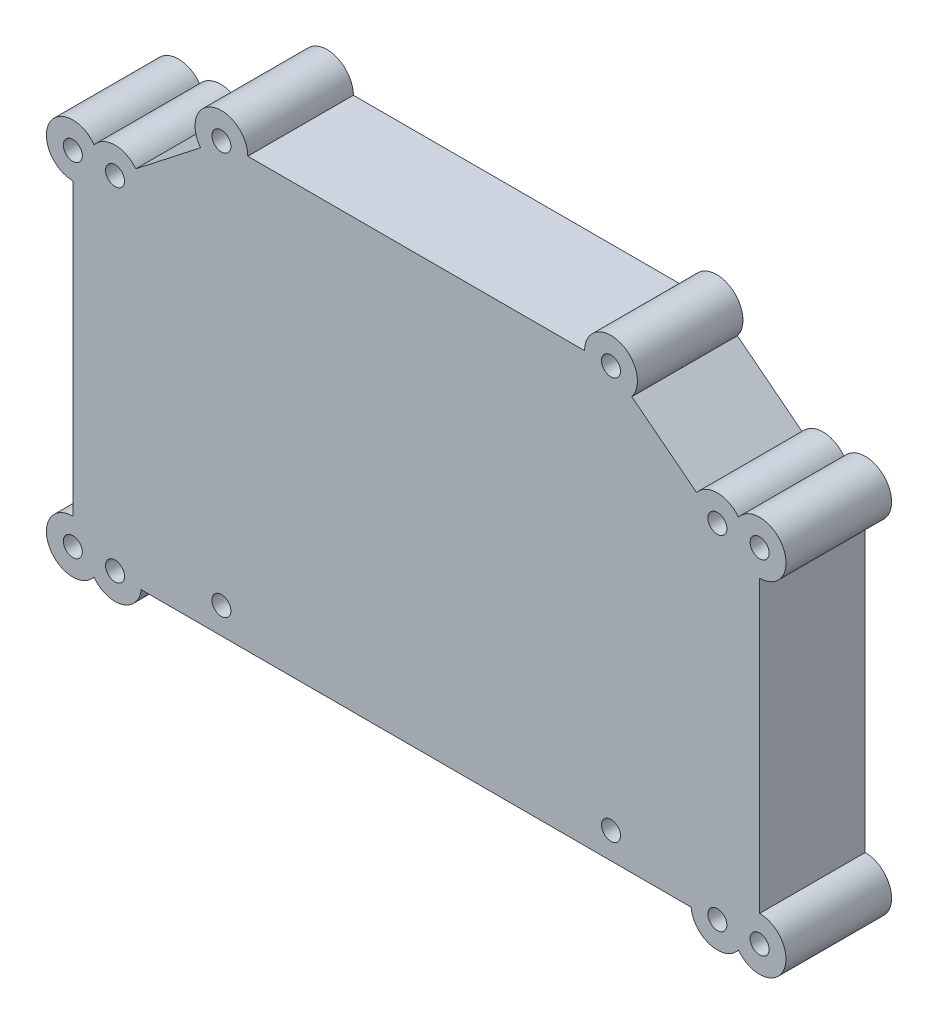
ISO-10303-21;
HEADER;
FILE_DESCRIPTION(('STEP AP214'),'2;1');
FILE_NAME('part.step','',(''),(''),'','','');
FILE_SCHEMA(('AUTOMOTIVE_DESIGN { 1 0 10303 214 1 1 1 1 }'));
ENDSEC;
DATA;
#1=APPLICATION_CONTEXT('core data for automotive mechanical design processes');
#2=APPLICATION_PROTOCOL_DEFINITION('international standard','automotive_design',2000,#1);
#3=PRODUCT_CONTEXT('',#1,'mechanical');
#4=PRODUCT('Part','Part','',(#3));
#5=PRODUCT_RELATED_PRODUCT_CATEGORY('part','',(#4));
#6=PRODUCT_DEFINITION_FORMATION('','',#4);
#7=PRODUCT_DEFINITION_CONTEXT('part definition',#1,'design');
#8=PRODUCT_DEFINITION('design','',#6,#7);
#9=PRODUCT_DEFINITION_SHAPE('','',#8);
#10=(LENGTH_UNIT() NAMED_UNIT(*) SI_UNIT(.MILLI.,.METRE.));
#11=(NAMED_UNIT(*) PLANE_ANGLE_UNIT() SI_UNIT($,.RADIAN.));
#12=(NAMED_UNIT(*) SI_UNIT($,.STERADIAN.) SOLID_ANGLE_UNIT());
#13=UNCERTAINTY_MEASURE_WITH_UNIT(LENGTH_MEASURE(1.E-05),#10,'distance_accuracy_value','');
#14=(GEOMETRIC_REPRESENTATION_CONTEXT(3) GLOBAL_UNCERTAINTY_ASSIGNED_CONTEXT((#13)) GLOBAL_UNIT_ASSIGNED_CONTEXT((#10,
#11,#12)) REPRESENTATION_CONTEXT('',''));
#15=CARTESIAN_POINT('',(0.,0.,0.));
#16=DIRECTION('',(0.,0.,1.));
#17=DIRECTION('',(1.,0.,0.));
#18=AXIS2_PLACEMENT_3D('',#15,#16,#17);
#19=CARTESIAN_POINT('',(0.,-43.1,20.));
#20=DIRECTION('',(0.,-1.,0.));
#21=DIRECTION('',(0.,0.,-1.));
#22=AXIS2_PLACEMENT_3D('',#19,#20,#21);
#23=PLANE('',#22);
#24=DIRECTION('',(-1.,0.,0.));
#25=VECTOR('',#24,1.);
#26=CARTESIAN_POINT('',(0.,-43.1,0.));
#27=LINE('',#26,#25);
#28=CARTESIAN_POINT('',(52.0702911731709,-43.1,0.));
#29=VERTEX_POINT('',#28);
#30=CARTESIAN_POINT('',(-52.0844733465611,-43.1,0.));
#31=VERTEX_POINT('',#30);
#32=EDGE_CURVE('E357',#29,#31,#27,.T.);
#33=ORIENTED_EDGE('',*,*,#32,.F.);
#34=DIRECTION('',(0.,0.,-1.));
#35=VECTOR('',#34,1.);
#36=CARTESIAN_POINT('',(52.0702911731709,-43.1,20.));
#37=LINE('',#36,#35);
#38=CARTESIAN_POINT('',(52.0702911731709,-43.1,20.));
#39=VERTEX_POINT('',#38);
#40=EDGE_CURVE('E12',#39,#29,#37,.T.);
#41=ORIENTED_EDGE('',*,*,#40,.F.);
#42=DIRECTION('',(-1.,0.,0.));
#43=VECTOR('',#42,1.);
#44=CARTESIAN_POINT('',(0.,-43.1,20.));
#45=LINE('',#44,#43);
#46=CARTESIAN_POINT('',(-52.0844733465611,-43.1,20.));
#47=VERTEX_POINT('',#46);
#48=EDGE_CURVE('E263',#39,#47,#45,.T.);
#49=ORIENTED_EDGE('',*,*,#48,.T.);
#50=DIRECTION('',(0.,0.,-1.));
#51=VECTOR('',#50,1.);
#52=CARTESIAN_POINT('',(-52.0844733465611,-43.1,20.));
#53=LINE('',#52,#51);
#54=EDGE_CURVE('E119',#47,#31,#53,.T.);
#55=ORIENTED_EDGE('',*,*,#54,.T.);
#56=EDGE_LOOP('',(#33,#41,#49,#55));
#57=FACE_BOUND('',#56,.T.);
#58=ADVANCED_FACE('F45',(#57),#23,.T.);
#59=CARTESIAN_POINT('',(57.05,-42.65,20.));
#60=DIRECTION('',(0.,0.,-1.));
#61=DIRECTION('',(-1.,0.,0.));
#62=AXIS2_PLACEMENT_3D('',#59,#60,#61);
#63=CYLINDRICAL_SURFACE('',#62,4.99999999999999);
#64=CARTESIAN_POINT('',(57.05,-42.65,0.));
#65=DIRECTION('',(0.,0.,1.));
#66=DIRECTION('',(1.,0.,0.));
#67=AXIS2_PLACEMENT_3D('',#64,#65,#66);
#68=CIRCLE('',#67,4.99999999999999);
#69=CARTESIAN_POINT('',(61.05,-45.65,0.));
#70=VERTEX_POINT('',#69);
#71=EDGE_CURVE('E348',#29,#70,#68,.T.);
#72=ORIENTED_EDGE('',*,*,#71,.T.);
#73=DIRECTION('',(0.,0.,-1.));
#74=VECTOR('',#73,1.);
#75=CARTESIAN_POINT('',(61.05,-45.65,20.));
#76=LINE('',#75,#74);
#77=CARTESIAN_POINT('',(61.05,-45.65,20.));
#78=VERTEX_POINT('',#77);
#79=EDGE_CURVE('E52',#78,#70,#76,.T.);
#80=ORIENTED_EDGE('',*,*,#79,.F.);
#81=CARTESIAN_POINT('',(57.05,-42.65,20.));
#82=DIRECTION('',(0.,0.,1.));
#83=DIRECTION('',(1.,0.,0.));
#84=AXIS2_PLACEMENT_3D('',#81,#82,#83);
#85=CIRCLE('',#84,4.99999999999999);
#86=EDGE_CURVE('E267',#39,#78,#85,.T.);
#87=ORIENTED_EDGE('',*,*,#86,.F.);
#88=ORIENTED_EDGE('',*,*,#40,.T.);
#89=EDGE_LOOP('',(#72,#80,#87,#88));
#90=FACE_BOUND('',#89,.T.);
#91=ADVANCED_FACE('F537',(#90),#63,.T.);
#92=CARTESIAN_POINT('',(65.05,-42.65,20.));
#93=DIRECTION('',(0.,0.,-1.));
#94=DIRECTION('',(-1.,0.,0.));
#95=AXIS2_PLACEMENT_3D('',#92,#93,#94);
#96=CYLINDRICAL_SURFACE('',#95,5.);
#97=CARTESIAN_POINT('',(65.05,-42.65,0.));
#98=DIRECTION('',(0.,0.,1.));
#99=DIRECTION('',(1.,0.,0.));
#100=AXIS2_PLACEMENT_3D('',#97,#98,#99);
#101=CIRCLE('',#100,5.);
#102=CARTESIAN_POINT('',(65.05,-37.65,0.));
#103=VERTEX_POINT('',#102);
#104=EDGE_CURVE('E340',#70,#103,#101,.T.);
#105=ORIENTED_EDGE('',*,*,#104,.T.);
#106=DIRECTION('',(0.,0.,-1.));
#107=VECTOR('',#106,1.);
#108=CARTESIAN_POINT('',(65.05,-37.65,20.));
#109=LINE('',#108,#107);
#110=CARTESIAN_POINT('',(65.05,-37.65,20.));
#111=VERTEX_POINT('',#110);
#112=EDGE_CURVE('E327',#111,#103,#109,.T.);
#113=ORIENTED_EDGE('',*,*,#112,.F.);
#114=CARTESIAN_POINT('',(65.05,-42.65,20.));
#115=DIRECTION('',(0.,0.,1.));
#116=DIRECTION('',(1.,0.,0.));
#117=AXIS2_PLACEMENT_3D('',#114,#115,#116);
#118=CIRCLE('',#117,5.);
#119=EDGE_CURVE('E279',#78,#111,#118,.T.);
#120=ORIENTED_EDGE('',*,*,#119,.F.);
#121=ORIENTED_EDGE('',*,*,#79,.T.);
#122=EDGE_LOOP('',(#105,#113,#120,#121));
#123=FACE_BOUND('',#122,.T.);
#124=ADVANCED_FACE('F338',(#123),#96,.T.);
#125=CARTESIAN_POINT('',(65.05,0.,20.));
#126=DIRECTION('',(1.,0.,0.));
#127=DIRECTION('',(0.,1.,0.));
#128=AXIS2_PLACEMENT_3D('',#125,#126,#127);
#129=PLANE('',#128);
#130=DIRECTION('',(0.,-1.,0.));
#131=VECTOR('',#130,1.);
#132=CARTESIAN_POINT('',(65.05,0.,0.));
#133=LINE('',#132,#131);
#134=CARTESIAN_POINT('',(65.05,17.35,0.));
#135=VERTEX_POINT('',#134);
#136=EDGE_CURVE('E351',#135,#103,#133,.T.);
#137=ORIENTED_EDGE('',*,*,#136,.F.);
#138=DIRECTION('',(0.,0.,-1.));
#139=VECTOR('',#138,1.);
#140=CARTESIAN_POINT('',(65.05,17.35,20.));
#141=LINE('',#140,#139);
#142=CARTESIAN_POINT('',(65.05,17.35,20.));
#143=VERTEX_POINT('',#142);
#144=EDGE_CURVE('E323',#143,#135,#141,.T.);
#145=ORIENTED_EDGE('',*,*,#144,.F.);
#146=DIRECTION('',(0.,-1.,0.));
#147=VECTOR('',#146,1.);
#148=CARTESIAN_POINT('',(65.05,0.,20.));
#149=LINE('',#148,#147);
#150=EDGE_CURVE('E282',#143,#111,#149,.T.);
#151=ORIENTED_EDGE('',*,*,#150,.T.);
#152=ORIENTED_EDGE('',*,*,#112,.T.);
#153=EDGE_LOOP('',(#137,#145,#151,#152));
#154=FACE_BOUND('',#153,.T.);
#155=ADVANCED_FACE('F662',(#154),#129,.T.);
#156=CARTESIAN_POINT('',(65.05,22.35,20.));
#157=DIRECTION('',(0.,0.,-1.));
#158=DIRECTION('',(-1.,0.,0.));
#159=AXIS2_PLACEMENT_3D('',#156,#157,#158);
#160=CYLINDRICAL_SURFACE('',#159,5.);
#161=CARTESIAN_POINT('',(65.05,22.35,0.));
#162=DIRECTION('',(0.,0.,1.));
#163=DIRECTION('',(1.,0.,0.));
#164=AXIS2_PLACEMENT_3D('',#161,#162,#163);
#165=CIRCLE('',#164,5.);
#166=CARTESIAN_POINT('',(61.05,25.35,0.));
#167=VERTEX_POINT('',#166);
#168=EDGE_CURVE('E356',#135,#167,#165,.T.);
#169=ORIENTED_EDGE('',*,*,#168,.T.);
#170=DIRECTION('',(0.,0.,-1.));
#171=VECTOR('',#170,1.);
#172=CARTESIAN_POINT('',(61.05,25.35,20.));
#173=LINE('',#172,#171);
#174=CARTESIAN_POINT('',(61.05,25.35,20.));
#175=VERTEX_POINT('',#174);
#176=EDGE_CURVE('E319',#175,#167,#173,.T.);
#177=ORIENTED_EDGE('',*,*,#176,.F.);
#178=CARTESIAN_POINT('',(65.05,22.35,20.));
#179=DIRECTION('',(0.,0.,1.));
#180=DIRECTION('',(1.,0.,0.));
#181=AXIS2_PLACEMENT_3D('',#178,#179,#180);
#182=CIRCLE('',#181,5.);
#183=EDGE_CURVE('E288',#143,#175,#182,.T.);
#184=ORIENTED_EDGE('',*,*,#183,.F.);
#185=ORIENTED_EDGE('',*,*,#144,.T.);
#186=EDGE_LOOP('',(#169,#177,#184,#185));
#187=FACE_BOUND('',#186,.T.);
#188=ADVANCED_FACE('F736',(#187),#160,.T.);
#189=CARTESIAN_POINT('',(57.05,22.35,20.));
#190=DIRECTION('',(0.,0.,-1.));
#191=DIRECTION('',(-1.,0.,0.));
#192=AXIS2_PLACEMENT_3D('',#189,#190,#191);
#193=CYLINDRICAL_SURFACE('',#192,5.);
#194=CARTESIAN_POINT('',(57.05,22.35,0.));
#195=DIRECTION('',(0.,0.,1.));
#196=DIRECTION('',(1.,0.,0.));
#197=AXIS2_PLACEMENT_3D('',#194,#195,#196);
#198=CIRCLE('',#197,5.);
#199=CARTESIAN_POINT('',(53.1106192354054,25.4291685877104,0.));
#200=VERTEX_POINT('',#199);
#201=EDGE_CURVE('E378',#167,#200,#198,.T.);
#202=ORIENTED_EDGE('',*,*,#201,.T.);
#203=DIRECTION('',(0.,0.,-1.));
#204=VECTOR('',#203,1.);
#205=CARTESIAN_POINT('',(53.1106192354054,25.4291685877104,20.));
#206=LINE('',#205,#204);
#207=CARTESIAN_POINT('',(53.1106192354054,25.4291685877104,20.));
#208=VERTEX_POINT('',#207);
#209=EDGE_CURVE('E306',#208,#200,#206,.T.);
#210=ORIENTED_EDGE('',*,*,#209,.F.);
#211=CARTESIAN_POINT('',(57.05,22.35,20.));
#212=DIRECTION('',(0.,0.,1.));
#213=DIRECTION('',(1.,0.,0.));
#214=AXIS2_PLACEMENT_3D('',#211,#212,#213);
#215=CIRCLE('',#214,5.);
#216=EDGE_CURVE('E454',#175,#208,#215,.T.);
#217=ORIENTED_EDGE('',*,*,#216,.F.);
#218=ORIENTED_EDGE('',*,*,#176,.T.);
#219=EDGE_LOOP('',(#202,#210,#217,#218));
#220=FACE_BOUND('',#219,.T.);
#221=ADVANCED_FACE('F657',(#220),#193,.T.);
#222=CARTESIAN_POINT('',(32.4805147649006,41.5544363500157,20.));
#223=DIRECTION('',(0.615833717542077,0.787876152918912,0.));
#224=DIRECTION('',(-0.787876152918912,0.615833717542077,0.));
#225=AXIS2_PLACEMENT_3D('',#222,#223,#224);
#226=PLANE('',#225);
#227=DIRECTION('',(0.787876152918912,-0.615833717542077,0.));
#228=VECTOR('',#227,1.);
#229=CARTESIAN_POINT('',(32.4805147649006,41.5544363500157,0.));
#230=LINE('',#229,#228);
#231=CARTESIAN_POINT('',(40.8393807645946,35.0208314122896,0.));
#232=VERTEX_POINT('',#231);
#233=EDGE_CURVE('E571',#232,#200,#230,.T.);
#234=ORIENTED_EDGE('',*,*,#233,.F.);
#235=DIRECTION('',(0.,0.,-1.));
#236=VECTOR('',#235,1.);
#237=CARTESIAN_POINT('',(40.8393807645946,35.0208314122896,20.));
#238=LINE('',#237,#236);
#239=CARTESIAN_POINT('',(40.8393807645946,35.0208314122896,20.));
#240=VERTEX_POINT('',#239);
#241=EDGE_CURVE('E301',#240,#232,#238,.T.);
#242=ORIENTED_EDGE('',*,*,#241,.F.);
#243=DIRECTION('',(0.787876152918912,-0.615833717542077,0.));
#244=VECTOR('',#243,1.);
#245=CARTESIAN_POINT('',(32.4805147649006,41.5544363500157,20.));
#246=LINE('',#245,#244);
#247=EDGE_CURVE('E449',#240,#208,#246,.T.);
#248=ORIENTED_EDGE('',*,*,#247,.T.);
#249=ORIENTED_EDGE('',*,*,#209,.T.);
#250=EDGE_LOOP('',(#234,#242,#248,#249));
#251=FACE_BOUND('',#250,.T.);
#252=ADVANCED_FACE('F730',(#251),#226,.T.);
#253=CARTESIAN_POINT('',(36.9,38.1,20.));
#254=DIRECTION('',(0.,0.,-1.));
#255=DIRECTION('',(-1.,0.,0.));
#256=AXIS2_PLACEMENT_3D('',#253,#254,#255);
#257=CYLINDRICAL_SURFACE('',#256,5.);
#258=CARTESIAN_POINT('',(36.9,38.1,0.));
#259=DIRECTION('',(0.,0.,1.));
#260=DIRECTION('',(1.,0.,0.));
#261=AXIS2_PLACEMENT_3D('',#258,#259,#260);
#262=CIRCLE('',#261,5.);
#263=CARTESIAN_POINT('',(31.9,38.1,0.));
#264=VERTEX_POINT('',#263);
#265=EDGE_CURVE('E566',#232,#264,#262,.T.);
#266=ORIENTED_EDGE('',*,*,#265,.T.);
#267=DIRECTION('',(0.,0.,-1.));
#268=VECTOR('',#267,1.);
#269=CARTESIAN_POINT('',(31.9,38.1,20.));
#270=LINE('',#269,#268);
#271=CARTESIAN_POINT('',(31.9,38.1,20.));
#272=VERTEX_POINT('',#271);
#273=EDGE_CURVE('E307',#272,#264,#270,.T.);
#274=ORIENTED_EDGE('',*,*,#273,.F.);
#275=CARTESIAN_POINT('',(36.9,38.1,20.));
#276=DIRECTION('',(0.,0.,1.));
#277=DIRECTION('',(1.,0.,0.));
#278=AXIS2_PLACEMENT_3D('',#275,#276,#277);
#279=CIRCLE('',#278,5.);
#280=EDGE_CURVE('E446',#240,#272,#279,.T.);
#281=ORIENTED_EDGE('',*,*,#280,.F.);
#282=ORIENTED_EDGE('',*,*,#241,.T.);
#283=EDGE_LOOP('',(#266,#274,#281,#282));
#284=FACE_BOUND('',#283,.T.);
#285=ADVANCED_FACE('F567',(#284),#257,.T.);
#286=CARTESIAN_POINT('',(0.,38.1,20.));
#287=DIRECTION('',(0.,1.,0.));
#288=DIRECTION('',(0.,0.,1.));
#289=AXIS2_PLACEMENT_3D('',#286,#287,#288);
#290=PLANE('',#289);
#291=DIRECTION('',(1.,0.,0.));
#292=VECTOR('',#291,1.);
#293=CARTESIAN_POINT('',(0.,38.1,0.));
#294=LINE('',#293,#292);
#295=CARTESIAN_POINT('',(-31.9,38.1,0.));
#296=VERTEX_POINT('',#295);
#297=EDGE_CURVE('E395',#296,#264,#294,.T.);
#298=ORIENTED_EDGE('',*,*,#297,.F.);
#299=DIRECTION('',(0.,0.,-1.));
#300=VECTOR('',#299,1.);
#301=CARTESIAN_POINT('',(-31.9,38.1,20.));
#302=LINE('',#301,#300);
#303=CARTESIAN_POINT('',(-31.9,38.1,20.));
#304=VERTEX_POINT('',#303);
#305=EDGE_CURVE('E546',#304,#296,#302,.T.);
#306=ORIENTED_EDGE('',*,*,#305,.F.);
#307=DIRECTION('',(1.,0.,0.));
#308=VECTOR('',#307,1.);
#309=CARTESIAN_POINT('',(0.,38.1,20.));
#310=LINE('',#309,#308);
#311=EDGE_CURVE('E241',#304,#272,#310,.T.);
#312=ORIENTED_EDGE('',*,*,#311,.T.);
#313=ORIENTED_EDGE('',*,*,#273,.T.);
#314=EDGE_LOOP('',(#298,#306,#312,#313));
#315=FACE_BOUND('',#314,.T.);
#316=ADVANCED_FACE('F560',(#315),#290,.T.);
#317=CARTESIAN_POINT('',(-36.9,38.1,20.));
#318=DIRECTION('',(0.,0.,-1.));
#319=DIRECTION('',(-1.,0.,0.));
#320=AXIS2_PLACEMENT_3D('',#317,#318,#319);
#321=CYLINDRICAL_SURFACE('',#320,5.);
#322=CARTESIAN_POINT('',(-36.9,38.1,0.));
#323=DIRECTION('',(0.,0.,1.));
#324=DIRECTION('',(1.,0.,0.));
#325=AXIS2_PLACEMENT_3D('',#322,#323,#324);
#326=CIRCLE('',#325,5.);
#327=CARTESIAN_POINT('',(-40.839380764594,35.0208314122889,0.));
#328=VERTEX_POINT('',#327);
#329=EDGE_CURVE('E388',#296,#328,#326,.T.);
#330=ORIENTED_EDGE('',*,*,#329,.T.);
#331=DIRECTION('',(0.,0.,-1.));
#332=VECTOR('',#331,1.);
#333=CARTESIAN_POINT('',(-40.839380764594,35.0208314122889,20.));
#334=LINE('',#333,#332);
#335=CARTESIAN_POINT('',(-40.839380764594,35.0208314122889,20.));
#336=VERTEX_POINT('',#335);
#337=EDGE_CURVE('E544',#336,#328,#334,.T.);
#338=ORIENTED_EDGE('',*,*,#337,.F.);
#339=CARTESIAN_POINT('',(-36.9,38.1,20.));
#340=DIRECTION('',(0.,0.,1.));
#341=DIRECTION('',(1.,0.,0.));
#342=AXIS2_PLACEMENT_3D('',#339,#340,#341);
#343=CIRCLE('',#342,5.);
#344=EDGE_CURVE('E236',#304,#336,#343,.T.);
#345=ORIENTED_EDGE('',*,*,#344,.F.);
#346=ORIENTED_EDGE('',*,*,#305,.T.);
#347=EDGE_LOOP('',(#330,#338,#345,#346));
#348=FACE_BOUND('',#347,.T.);
#349=ADVANCED_FACE('F677',(#348),#321,.T.);
#350=CARTESIAN_POINT('',(-32.480514764898,41.554436350016,20.));
#351=DIRECTION('',(-0.615833717542045,0.787876152918938,0.));
#352=DIRECTION('',(-0.787876152918938,-0.615833717542045,0.));
#353=AXIS2_PLACEMENT_3D('',#350,#351,#352);
#354=PLANE('',#353);
#355=DIRECTION('',(0.787876152918938,0.615833717542045,0.));
#356=VECTOR('',#355,1.);
#357=CARTESIAN_POINT('',(-32.480514764898,41.554436350016,0.));
#358=LINE('',#357,#356);
#359=CARTESIAN_POINT('',(-53.1106192354053,25.4291685877102,0.));
#360=VERTEX_POINT('',#359);
#361=EDGE_CURVE('E394',#360,#328,#358,.T.);
#362=ORIENTED_EDGE('',*,*,#361,.F.);
#363=DIRECTION('',(0.,0.,-1.));
#364=VECTOR('',#363,1.);
#365=CARTESIAN_POINT('',(-53.1106192354053,25.4291685877102,20.));
#366=LINE('',#365,#364);
#367=CARTESIAN_POINT('',(-53.1106192354053,25.4291685877102,20.));
#368=VERTEX_POINT('',#367);
#369=EDGE_CURVE('E223',#368,#360,#366,.T.);
#370=ORIENTED_EDGE('',*,*,#369,.F.);
#371=DIRECTION('',(0.787876152918938,0.615833717542045,0.));
#372=VECTOR('',#371,1.);
#373=CARTESIAN_POINT('',(-32.480514764898,41.554436350016,20.));
#374=LINE('',#373,#372);
#375=EDGE_CURVE('E240',#368,#336,#374,.T.);
#376=ORIENTED_EDGE('',*,*,#375,.T.);
#377=ORIENTED_EDGE('',*,*,#337,.T.);
#378=EDGE_LOOP('',(#362,#370,#376,#377));
#379=FACE_BOUND('',#378,.T.);
#380=ADVANCED_FACE('F673',(#379),#354,.T.);
#381=CARTESIAN_POINT('',(-57.05,22.35,20.));
#382=DIRECTION('',(0.,0.,-1.));
#383=DIRECTION('',(-1.,0.,0.));
#384=AXIS2_PLACEMENT_3D('',#381,#382,#383);
#385=CYLINDRICAL_SURFACE('',#384,5.00000000000001);
#386=CARTESIAN_POINT('',(-57.05,22.35,0.));
#387=DIRECTION('',(0.,0.,1.));
#388=DIRECTION('',(1.,0.,0.));
#389=AXIS2_PLACEMENT_3D('',#386,#387,#388);
#390=CIRCLE('',#389,5.00000000000001);
#391=CARTESIAN_POINT('',(-60.9983731936088,25.417629235092,0.));
#392=VERTEX_POINT('',#391);
#393=EDGE_CURVE('E406',#360,#392,#390,.T.);
#394=ORIENTED_EDGE('',*,*,#393,.T.);
#395=DIRECTION('',(0.,0.,-1.));
#396=VECTOR('',#395,1.);
#397=CARTESIAN_POINT('',(-60.9983731936088,25.417629235092,20.));
#398=LINE('',#397,#396);
#399=CARTESIAN_POINT('',(-60.9983731936088,25.417629235092,20.));
#400=VERTEX_POINT('',#399);
#401=EDGE_CURVE('E219',#400,#392,#398,.T.);
#402=ORIENTED_EDGE('',*,*,#401,.F.);
#403=CARTESIAN_POINT('',(-57.05,22.35,20.));
#404=DIRECTION('',(0.,0.,1.));
#405=DIRECTION('',(1.,0.,0.));
#406=AXIS2_PLACEMENT_3D('',#403,#404,#405);
#407=CIRCLE('',#406,5.00000000000001);
#408=EDGE_CURVE('E251',#368,#400,#407,.T.);
#409=ORIENTED_EDGE('',*,*,#408,.F.);
#410=ORIENTED_EDGE('',*,*,#369,.T.);
#411=EDGE_LOOP('',(#394,#402,#409,#410));
#412=FACE_BOUND('',#411,.T.);
#413=ADVANCED_FACE('F681',(#412),#385,.T.);
#414=CARTESIAN_POINT('',(-65.0488417535076,22.4861271550533,20.));
#415=DIRECTION('',(0.,0.,-1.));
#416=DIRECTION('',(-1.,0.,0.));
#417=AXIS2_PLACEMENT_3D('',#414,#415,#416);
#418=CYLINDRICAL_SURFACE('',#417,5.);
#419=CARTESIAN_POINT('',(-65.0488417535076,22.4861271550533,0.));
#420=DIRECTION('',(0.,0.,1.));
#421=DIRECTION('',(1.,0.,0.));
#422=AXIS2_PLACEMENT_3D('',#419,#420,#421);
#423=CIRCLE('',#422,5.);
#424=CARTESIAN_POINT('',(-65.0488417535076,17.4861271550533,0.));
#425=VERTEX_POINT('',#424);
#426=EDGE_CURVE('E409',#392,#425,#423,.T.);
#427=ORIENTED_EDGE('',*,*,#426,.T.);
#428=DIRECTION('',(0.,0.,-1.));
#429=VECTOR('',#428,1.);
#430=CARTESIAN_POINT('',(-65.0488417535076,17.4861271550533,20.));
#431=LINE('',#430,#429);
#432=CARTESIAN_POINT('',(-65.0488417535076,17.4861271550533,20.));
#433=VERTEX_POINT('',#432);
#434=EDGE_CURVE('E180',#433,#425,#431,.T.);
#435=ORIENTED_EDGE('',*,*,#434,.F.);
#436=CARTESIAN_POINT('',(-65.0488417535076,22.4861271550533,20.));
#437=DIRECTION('',(0.,0.,1.));
#438=DIRECTION('',(1.,0.,0.));
#439=AXIS2_PLACEMENT_3D('',#436,#437,#438);
#440=CIRCLE('',#439,5.);
#441=EDGE_CURVE('E169',#400,#433,#440,.T.);
#442=ORIENTED_EDGE('',*,*,#441,.F.);
#443=ORIENTED_EDGE('',*,*,#401,.T.);
#444=EDGE_LOOP('',(#427,#435,#442,#443));
#445=FACE_BOUND('',#444,.T.);
#446=ADVANCED_FACE('F683',(#445),#418,.T.);
#447=CARTESIAN_POINT('',(-65.0492099654857,0.00136987307803026,20.));
#448=DIRECTION('',(0.999999999778259,-2.10590271342779E-05,0.));
#449=DIRECTION('',(2.10590271342779E-05,0.999999999778259,0.));
#450=AXIS2_PLACEMENT_3D('',#447,#448,#449);
#451=PLANE('',#450);
#452=DIRECTION('',(-2.10590271342779E-05,-0.999999999778259,0.));
#453=VECTOR('',#452,1.);
#454=CARTESIAN_POINT('',(-65.0492099654857,0.00136987307803026,0.));
#455=LINE('',#454,#453);
#456=CARTESIAN_POINT('',(-65.05,-37.5138728346272,0.));
#457=VERTEX_POINT('',#456);
#458=EDGE_CURVE('E178',#425,#457,#455,.T.);
#459=ORIENTED_EDGE('',*,*,#458,.T.);
#460=DIRECTION('',(0.,0.,-1.));
#461=VECTOR('',#460,1.);
#462=CARTESIAN_POINT('',(-65.05,-37.5138728346272,20.));
#463=LINE('',#462,#461);
#464=CARTESIAN_POINT('',(-65.05,-37.5138728346272,20.));
#465=VERTEX_POINT('',#464);
#466=EDGE_CURVE('E175',#465,#457,#463,.T.);
#467=ORIENTED_EDGE('',*,*,#466,.F.);
#468=DIRECTION('',(-2.10590271342779E-05,-0.999999999778259,0.));
#469=VECTOR('',#468,1.);
#470=CARTESIAN_POINT('',(-65.0492099654857,0.00136987307803026,20.));
#471=LINE('',#470,#469);
#472=EDGE_CURVE('E162',#433,#465,#471,.T.);
#473=ORIENTED_EDGE('',*,*,#472,.F.);
#474=ORIENTED_EDGE('',*,*,#434,.T.);
#475=EDGE_LOOP('',(#459,#467,#473,#474));
#476=FACE_BOUND('',#475,.T.);
#477=ADVANCED_FACE('F176',(#476),#451,.F.);
#478=CARTESIAN_POINT('',(-65.05,-42.5138728346272,20.));
#479=DIRECTION('',(0.,0.,-1.));
#480=DIRECTION('',(-1.,0.,0.));
#481=AXIS2_PLACEMENT_3D('',#478,#479,#480);
#482=CYLINDRICAL_SURFACE('',#481,5.);
#483=CARTESIAN_POINT('',(-65.05,-42.5138728346272,0.));
#484=DIRECTION('',(0.,0.,1.));
#485=DIRECTION('',(1.,0.,0.));
#486=AXIS2_PLACEMENT_3D('',#483,#484,#485);
#487=CIRCLE('',#486,5.);
#488=CARTESIAN_POINT('',(-61.05,-45.5138728346272,0.));
#489=VERTEX_POINT('',#488);
#490=EDGE_CURVE('E112',#457,#489,#487,.T.);
#491=ORIENTED_EDGE('',*,*,#490,.T.);
#492=DIRECTION('',(0.,0.,-1.));
#493=VECTOR('',#492,1.);
#494=CARTESIAN_POINT('',(-61.05,-45.5138728346272,20.));
#495=LINE('',#494,#493);
#496=CARTESIAN_POINT('',(-61.05,-45.5138728346272,20.));
#497=VERTEX_POINT('',#496);
#498=EDGE_CURVE('E181',#497,#489,#495,.T.);
#499=ORIENTED_EDGE('',*,*,#498,.F.);
#500=CARTESIAN_POINT('',(-65.05,-42.5138728346272,20.));
#501=DIRECTION('',(0.,0.,1.));
#502=DIRECTION('',(1.,0.,0.));
#503=AXIS2_PLACEMENT_3D('',#500,#501,#502);
#504=CIRCLE('',#503,5.);
#505=EDGE_CURVE('E167',#465,#497,#504,.T.);
#506=ORIENTED_EDGE('',*,*,#505,.F.);
#507=ORIENTED_EDGE('',*,*,#466,.T.);
#508=EDGE_LOOP('',(#491,#499,#506,#507));
#509=FACE_BOUND('',#508,.T.);
#510=ADVANCED_FACE('F183',(#509),#482,.T.);
#511=CARTESIAN_POINT('',(57.05,-42.65,20.));
#512=DIRECTION('',(0.,0.,-1.));
#513=DIRECTION('',(-1.,0.,0.));
#514=AXIS2_PLACEMENT_3D('',#511,#512,#513);
#515=CYLINDRICAL_SURFACE('',#514,1.8);
#516=CARTESIAN_POINT('',(57.05,-42.65,20.));
#517=DIRECTION('',(0.,0.,1.));
#518=DIRECTION('',(1.,0.,0.));
#519=AXIS2_PLACEMENT_3D('',#516,#517,#518);
#520=CIRCLE('',#519,1.8);
#521=CARTESIAN_POINT('',(58.85,-42.65,20.));
#522=VERTEX_POINT('',#521);
#523=EDGE_CURVE('E578',#522,#522,#520,.T.);
#524=ORIENTED_EDGE('',*,*,#523,.T.);
#525=EDGE_LOOP('',(#524));
#526=FACE_BOUND('',#525,.T.);
#527=CARTESIAN_POINT('',(57.05,-42.65,0.));
#528=DIRECTION('',(0.,0.,1.));
#529=DIRECTION('',(1.,0.,0.));
#530=AXIS2_PLACEMENT_3D('',#527,#528,#529);
#531=CIRCLE('',#530,1.8);
#532=CARTESIAN_POINT('',(58.85,-42.65,0.));
#533=VERTEX_POINT('',#532);
#534=EDGE_CURVE('E591',#533,#533,#531,.T.);
#535=ORIENTED_EDGE('',*,*,#534,.F.);
#536=EDGE_LOOP('',(#535));
#537=FACE_BOUND('',#536,.T.);
#538=ADVANCED_FACE('F715',(#526,#537),#515,.F.);
#539=CARTESIAN_POINT('',(65.05,22.35,20.));
#540=DIRECTION('',(0.,0.,-1.));
#541=DIRECTION('',(-1.,0.,0.));
#542=AXIS2_PLACEMENT_3D('',#539,#540,#541);
#543=CYLINDRICAL_SURFACE('',#542,1.79999999999999);
#544=CARTESIAN_POINT('',(65.05,22.35,20.));
#545=DIRECTION('',(0.,0.,1.));
#546=DIRECTION('',(1.,0.,0.));
#547=AXIS2_PLACEMENT_3D('',#544,#545,#546);
#548=CIRCLE('',#547,1.79999999999999);
#549=CARTESIAN_POINT('',(66.85,22.35,20.));
#550=VERTEX_POINT('',#549);
#551=EDGE_CURVE('E434',#550,#550,#548,.T.);
#552=ORIENTED_EDGE('',*,*,#551,.T.);
#553=EDGE_LOOP('',(#552));
#554=FACE_BOUND('',#553,.T.);
#555=CARTESIAN_POINT('',(65.05,22.35,0.));
#556=DIRECTION('',(0.,0.,1.));
#557=DIRECTION('',(1.,0.,0.));
#558=AXIS2_PLACEMENT_3D('',#555,#556,#557);
#559=CIRCLE('',#558,1.79999999999999);
#560=CARTESIAN_POINT('',(66.85,22.35,0.));
#561=VERTEX_POINT('',#560);
#562=EDGE_CURVE('E594',#561,#561,#559,.T.);
#563=ORIENTED_EDGE('',*,*,#562,.F.);
#564=EDGE_LOOP('',(#563));
#565=FACE_BOUND('',#564,.T.);
#566=ADVANCED_FACE('F788',(#554,#565),#543,.F.);
#567=CARTESIAN_POINT('',(57.05,22.35,20.));
#568=DIRECTION('',(0.,0.,-1.));
#569=DIRECTION('',(-1.,0.,0.));
#570=AXIS2_PLACEMENT_3D('',#567,#568,#569);
#571=CYLINDRICAL_SURFACE('',#570,1.8);
#572=CARTESIAN_POINT('',(57.05,22.35,20.));
#573=DIRECTION('',(0.,0.,1.));
#574=DIRECTION('',(1.,0.,0.));
#575=AXIS2_PLACEMENT_3D('',#572,#573,#574);
#576=CIRCLE('',#575,1.8);
#577=CARTESIAN_POINT('',(58.85,22.35,20.));
#578=VERTEX_POINT('',#577);
#579=EDGE_CURVE('E428',#578,#578,#576,.T.);
#580=ORIENTED_EDGE('',*,*,#579,.T.);
#581=EDGE_LOOP('',(#580));
#582=FACE_BOUND('',#581,.T.);
#583=CARTESIAN_POINT('',(57.05,22.35,0.));
#584=DIRECTION('',(0.,0.,1.));
#585=DIRECTION('',(1.,0.,0.));
#586=AXIS2_PLACEMENT_3D('',#583,#584,#585);
#587=CIRCLE('',#586,1.8);
#588=CARTESIAN_POINT('',(58.85,22.35,0.));
#589=VERTEX_POINT('',#588);
#590=EDGE_CURVE('E603',#589,#589,#587,.T.);
#591=ORIENTED_EDGE('',*,*,#590,.F.);
#592=EDGE_LOOP('',(#591));
#593=FACE_BOUND('',#592,.T.);
#594=ADVANCED_FACE('F796',(#582,#593),#571,.F.);
#595=CARTESIAN_POINT('',(-57.05,-42.5138728346272,20.));
#596=DIRECTION('',(0.,0.,-1.));
#597=DIRECTION('',(-1.,0.,0.));
#598=AXIS2_PLACEMENT_3D('',#595,#596,#597);
#599=CYLINDRICAL_SURFACE('',#598,1.8);
#600=CARTESIAN_POINT('',(-57.05,-42.5138728346272,20.));
#601=DIRECTION('',(0.,0.,1.));
#602=DIRECTION('',(1.,0.,0.));
#603=AXIS2_PLACEMENT_3D('',#600,#601,#602);
#604=CIRCLE('',#603,1.8);
#605=CARTESIAN_POINT('',(-55.25,-42.5138728346272,20.));
#606=VERTEX_POINT('',#605);
#607=EDGE_CURVE('E435',#606,#606,#604,.T.);
#608=ORIENTED_EDGE('',*,*,#607,.T.);
#609=EDGE_LOOP('',(#608));
#610=FACE_BOUND('',#609,.T.);
#611=CARTESIAN_POINT('',(-57.05,-42.5138728346272,0.));
#612=DIRECTION('',(0.,0.,1.));
#613=DIRECTION('',(1.,0.,0.));
#614=AXIS2_PLACEMENT_3D('',#611,#612,#613);
#615=CIRCLE('',#614,1.8);
#616=CARTESIAN_POINT('',(-55.25,-42.5138728346272,0.));
#617=VERTEX_POINT('',#616);
#618=EDGE_CURVE('E489',#617,#617,#615,.T.);
#619=ORIENTED_EDGE('',*,*,#618,.F.);
#620=EDGE_LOOP('',(#619));
#621=FACE_BOUND('',#620,.T.);
#622=ADVANCED_FACE('F804',(#610,#621),#599,.F.);
#623=CARTESIAN_POINT('',(-65.05,-42.5138728346272,20.));
#624=DIRECTION('',(0.,0.,-1.));
#625=DIRECTION('',(-1.,0.,0.));
#626=AXIS2_PLACEMENT_3D('',#623,#624,#625);
#627=CYLINDRICAL_SURFACE('',#626,1.79999999999999);
#628=CARTESIAN_POINT('',(-65.05,-42.5138728346272,20.));
#629=DIRECTION('',(0.,0.,1.));
#630=DIRECTION('',(1.,0.,0.));
#631=AXIS2_PLACEMENT_3D('',#628,#629,#630);
#632=CIRCLE('',#631,1.79999999999999);
#633=CARTESIAN_POINT('',(-63.25,-42.5138728346272,20.));
#634=VERTEX_POINT('',#633);
#635=EDGE_CURVE('E597',#634,#634,#632,.T.);
#636=ORIENTED_EDGE('',*,*,#635,.T.);
#637=EDGE_LOOP('',(#636));
#638=FACE_BOUND('',#637,.T.);
#639=CARTESIAN_POINT('',(-65.05,-42.5138728346272,0.));
#640=DIRECTION('',(0.,0.,1.));
#641=DIRECTION('',(1.,0.,0.));
#642=AXIS2_PLACEMENT_3D('',#639,#640,#641);
#643=CIRCLE('',#642,1.79999999999999);
#644=CARTESIAN_POINT('',(-63.25,-42.5138728346272,0.));
#645=VERTEX_POINT('',#644);
#646=EDGE_CURVE('E485',#645,#645,#643,.T.);
#647=ORIENTED_EDGE('',*,*,#646,.F.);
#648=EDGE_LOOP('',(#647));
#649=FACE_BOUND('',#648,.T.);
#650=ADVANCED_FACE('F812',(#638,#649),#627,.F.);
#651=CARTESIAN_POINT('',(-57.05,22.35,20.));
#652=DIRECTION('',(0.,0.,-1.));
#653=DIRECTION('',(-1.,0.,0.));
#654=AXIS2_PLACEMENT_3D('',#651,#652,#653);
#655=CYLINDRICAL_SURFACE('',#654,1.79999999999999);
#656=CARTESIAN_POINT('',(-57.05,22.35,20.));
#657=DIRECTION('',(0.,0.,1.));
#658=DIRECTION('',(1.,0.,0.));
#659=AXIS2_PLACEMENT_3D('',#656,#657,#658);
#660=CIRCLE('',#659,1.79999999999999);
#661=CARTESIAN_POINT('',(-55.25,22.35,20.));
#662=VERTEX_POINT('',#661);
#663=EDGE_CURVE('E600',#662,#662,#660,.T.);
#664=ORIENTED_EDGE('',*,*,#663,.T.);
#665=EDGE_LOOP('',(#664));
#666=FACE_BOUND('',#665,.T.);
#667=CARTESIAN_POINT('',(-57.05,22.35,0.));
#668=DIRECTION('',(0.,0.,1.));
#669=DIRECTION('',(1.,0.,0.));
#670=AXIS2_PLACEMENT_3D('',#667,#668,#669);
#671=CIRCLE('',#670,1.79999999999999);
#672=CARTESIAN_POINT('',(-55.25,22.35,0.));
#673=VERTEX_POINT('',#672);
#674=EDGE_CURVE('E470',#673,#673,#671,.T.);
#675=ORIENTED_EDGE('',*,*,#674,.F.);
#676=EDGE_LOOP('',(#675));
#677=FACE_BOUND('',#676,.T.);
#678=ADVANCED_FACE('F532',(#666,#677),#655,.F.);
#679=CARTESIAN_POINT('',(-65.0488417535076,22.4861271550533,20.));
#680=DIRECTION('',(0.,0.,-1.));
#681=DIRECTION('',(-1.,0.,0.));
#682=AXIS2_PLACEMENT_3D('',#679,#680,#681);
#683=CYLINDRICAL_SURFACE('',#682,1.79999999999999);
#684=CARTESIAN_POINT('',(-65.0488417535076,22.4861271550533,20.));
#685=DIRECTION('',(0.,0.,1.));
#686=DIRECTION('',(1.,0.,0.));
#687=AXIS2_PLACEMENT_3D('',#684,#685,#686);
#688=CIRCLE('',#687,1.79999999999999);
#689=CARTESIAN_POINT('',(-63.2488417535076,22.4861271550533,20.));
#690=VERTEX_POINT('',#689);
#691=EDGE_CURVE('E586',#690,#690,#688,.T.);
#692=ORIENTED_EDGE('',*,*,#691,.T.);
#693=EDGE_LOOP('',(#692));
#694=FACE_BOUND('',#693,.T.);
#695=CARTESIAN_POINT('',(-65.0488417535076,22.4861271550533,0.));
#696=DIRECTION('',(0.,0.,1.));
#697=DIRECTION('',(1.,0.,0.));
#698=AXIS2_PLACEMENT_3D('',#695,#696,#697);
#699=CIRCLE('',#698,1.79999999999999);
#700=CARTESIAN_POINT('',(-63.2488417535076,22.4861271550533,0.));
#701=VERTEX_POINT('',#700);
#702=EDGE_CURVE('E465',#701,#701,#699,.T.);
#703=ORIENTED_EDGE('',*,*,#702,.F.);
#704=EDGE_LOOP('',(#703));
#705=FACE_BOUND('',#704,.T.);
#706=ADVANCED_FACE('F522',(#694,#705),#683,.F.);
#707=CARTESIAN_POINT('',(36.9,38.1,20.));
#708=DIRECTION('',(0.,0.,-1.));
#709=DIRECTION('',(-1.,0.,0.));
#710=AXIS2_PLACEMENT_3D('',#707,#708,#709);
#711=CYLINDRICAL_SURFACE('',#710,1.8);
#712=CARTESIAN_POINT('',(36.9,38.1,20.));
#713=DIRECTION('',(0.,0.,1.));
#714=DIRECTION('',(1.,0.,0.));
#715=AXIS2_PLACEMENT_3D('',#712,#713,#714);
#716=CIRCLE('',#715,1.8);
#717=CARTESIAN_POINT('',(38.7,38.1,20.));
#718=VERTEX_POINT('',#717);
#719=EDGE_CURVE('E584',#718,#718,#716,.T.);
#720=ORIENTED_EDGE('',*,*,#719,.T.);
#721=EDGE_LOOP('',(#720));
#722=FACE_BOUND('',#721,.T.);
#723=CARTESIAN_POINT('',(36.9,38.1,0.));
#724=DIRECTION('',(0.,0.,1.));
#725=DIRECTION('',(1.,0.,0.));
#726=AXIS2_PLACEMENT_3D('',#723,#724,#725);
#727=CIRCLE('',#726,1.8);
#728=CARTESIAN_POINT('',(38.7,38.1,0.));
#729=VERTEX_POINT('',#728);
#730=EDGE_CURVE('E471',#729,#729,#727,.T.);
#731=ORIENTED_EDGE('',*,*,#730,.F.);
#732=EDGE_LOOP('',(#731));
#733=FACE_BOUND('',#732,.T.);
#734=ADVANCED_FACE('F519',(#722,#733),#711,.F.);
#735=CARTESIAN_POINT('',(-36.9,38.1,20.));
#736=DIRECTION('',(0.,0.,-1.));
#737=DIRECTION('',(-1.,0.,0.));
#738=AXIS2_PLACEMENT_3D('',#735,#736,#737);
#739=CYLINDRICAL_SURFACE('',#738,1.8);
#740=CARTESIAN_POINT('',(-36.9,38.1,20.));
#741=DIRECTION('',(0.,0.,1.));
#742=DIRECTION('',(1.,0.,0.));
#743=AXIS2_PLACEMENT_3D('',#740,#741,#742);
#744=CIRCLE('',#743,1.8);
#745=CARTESIAN_POINT('',(-35.1,38.1,20.));
#746=VERTEX_POINT('',#745);
#747=EDGE_CURVE('E587',#746,#746,#744,.F.);
#748=ORIENTED_EDGE('',*,*,#747,.F.);
#749=EDGE_LOOP('',(#748));
#750=FACE_BOUND('',#749,.T.);
#751=CARTESIAN_POINT('',(-36.9,38.1,0.));
#752=DIRECTION('',(0.,0.,1.));
#753=DIRECTION('',(1.,0.,0.));
#754=AXIS2_PLACEMENT_3D('',#751,#752,#753);
#755=CIRCLE('',#754,1.8);
#756=CARTESIAN_POINT('',(-35.1,38.1,0.));
#757=VERTEX_POINT('',#756);
#758=EDGE_CURVE('E502',#757,#757,#755,.F.);
#759=ORIENTED_EDGE('',*,*,#758,.T.);
#760=EDGE_LOOP('',(#759));
#761=FACE_BOUND('',#760,.T.);
#762=ADVANCED_FACE('F521',(#750,#761),#739,.F.);
#763=CARTESIAN_POINT('',(-36.9,-38.1,20.));
#764=DIRECTION('',(0.,0.,-1.));
#765=DIRECTION('',(-1.,0.,0.));
#766=AXIS2_PLACEMENT_3D('',#763,#764,#765);
#767=CYLINDRICAL_SURFACE('',#766,1.8);
#768=CARTESIAN_POINT('',(-36.9,-38.1,20.));
#769=DIRECTION('',(0.,0.,1.));
#770=DIRECTION('',(1.,0.,0.));
#771=AXIS2_PLACEMENT_3D('',#768,#769,#770);
#772=CIRCLE('',#771,1.8);
#773=CARTESIAN_POINT('',(-35.1,-38.1,20.));
#774=VERTEX_POINT('',#773);
#775=EDGE_CURVE('E581',#774,#774,#772,.T.);
#776=ORIENTED_EDGE('',*,*,#775,.T.);
#777=EDGE_LOOP('',(#776));
#778=FACE_BOUND('',#777,.T.);
#779=CARTESIAN_POINT('',(-36.9,-38.1,0.));
#780=DIRECTION('',(0.,0.,1.));
#781=DIRECTION('',(1.,0.,0.));
#782=AXIS2_PLACEMENT_3D('',#779,#780,#781);
#783=CIRCLE('',#782,1.8);
#784=CARTESIAN_POINT('',(-35.1,-38.1,0.));
#785=VERTEX_POINT('',#784);
#786=EDGE_CURVE('E497',#785,#785,#783,.T.);
#787=ORIENTED_EDGE('',*,*,#786,.F.);
#788=EDGE_LOOP('',(#787));
#789=FACE_BOUND('',#788,.T.);
#790=ADVANCED_FACE('F529',(#778,#789),#767,.F.);
#791=CARTESIAN_POINT('',(36.9,-38.1,20.));
#792=DIRECTION('',(0.,0.,-1.));
#793=DIRECTION('',(-1.,0.,0.));
#794=AXIS2_PLACEMENT_3D('',#791,#792,#793);
#795=CYLINDRICAL_SURFACE('',#794,1.8);
#796=CARTESIAN_POINT('',(36.9,-38.1,20.));
#797=DIRECTION('',(0.,0.,1.));
#798=DIRECTION('',(1.,0.,0.));
#799=AXIS2_PLACEMENT_3D('',#796,#797,#798);
#800=CIRCLE('',#799,1.8);
#801=CARTESIAN_POINT('',(38.7,-38.1,20.));
#802=VERTEX_POINT('',#801);
#803=EDGE_CURVE('E187',#802,#802,#800,.F.);
#804=ORIENTED_EDGE('',*,*,#803,.F.);
#805=EDGE_LOOP('',(#804));
#806=FACE_BOUND('',#805,.T.);
#807=CARTESIAN_POINT('',(36.9,-38.1,0.));
#808=DIRECTION('',(0.,0.,1.));
#809=DIRECTION('',(1.,0.,0.));
#810=AXIS2_PLACEMENT_3D('',#807,#808,#809);
#811=CIRCLE('',#810,1.8);
#812=CARTESIAN_POINT('',(38.7,-38.1,0.));
#813=VERTEX_POINT('',#812);
#814=EDGE_CURVE('E503',#813,#813,#811,.F.);
#815=ORIENTED_EDGE('',*,*,#814,.T.);
#816=EDGE_LOOP('',(#815));
#817=FACE_BOUND('',#816,.T.);
#818=ADVANCED_FACE('F693',(#806,#817),#795,.F.);
#819=CARTESIAN_POINT('',(-57.05,-42.5138728346272,20.));
#820=DIRECTION('',(0.,0.,-1.));
#821=DIRECTION('',(-1.,0.,0.));
#822=AXIS2_PLACEMENT_3D('',#819,#820,#821);
#823=CYLINDRICAL_SURFACE('',#822,5.);
#824=CARTESIAN_POINT('',(-57.05,-42.5138728346272,0.));
#825=DIRECTION('',(0.,0.,1.));
#826=DIRECTION('',(1.,0.,0.));
#827=AXIS2_PLACEMENT_3D('',#824,#825,#826);
#828=CIRCLE('',#827,5.);
#829=EDGE_CURVE('E684',#489,#31,#828,.T.);
#830=ORIENTED_EDGE('',*,*,#829,.T.);
#831=ORIENTED_EDGE('',*,*,#54,.F.);
#832=CARTESIAN_POINT('',(-57.05,-42.5138728346272,20.));
#833=DIRECTION('',(0.,0.,1.));
#834=DIRECTION('',(1.,0.,0.));
#835=AXIS2_PLACEMENT_3D('',#832,#833,#834);
#836=CIRCLE('',#835,5.);
#837=EDGE_CURVE('E60',#497,#47,#836,.T.);
#838=ORIENTED_EDGE('',*,*,#837,.F.);
#839=ORIENTED_EDGE('',*,*,#498,.T.);
#840=EDGE_LOOP('',(#830,#831,#838,#839));
#841=FACE_BOUND('',#840,.T.);
#842=ADVANCED_FACE('F706',(#841),#823,.T.);
#843=CARTESIAN_POINT('',(65.05,-42.65,20.));
#844=DIRECTION('',(0.,0.,-1.));
#845=DIRECTION('',(-1.,0.,0.));
#846=AXIS2_PLACEMENT_3D('',#843,#844,#845);
#847=CYLINDRICAL_SURFACE('',#846,1.79999999999999);
#848=CARTESIAN_POINT('',(65.05,-42.65,20.));
#849=DIRECTION('',(0.,0.,1.));
#850=DIRECTION('',(1.,0.,0.));
#851=AXIS2_PLACEMENT_3D('',#848,#849,#850);
#852=CIRCLE('',#851,1.79999999999999);
#853=CARTESIAN_POINT('',(66.85,-42.65,20.));
#854=VERTEX_POINT('',#853);
#855=EDGE_CURVE('E206',#854,#854,#852,.T.);
#856=ORIENTED_EDGE('',*,*,#855,.T.);
#857=EDGE_LOOP('',(#856));
#858=FACE_BOUND('',#857,.T.);
#859=CARTESIAN_POINT('',(65.05,-42.65,0.));
#860=DIRECTION('',(0.,0.,1.));
#861=DIRECTION('',(1.,0.,0.));
#862=AXIS2_PLACEMENT_3D('',#859,#860,#861);
#863=CIRCLE('',#862,1.79999999999999);
#864=CARTESIAN_POINT('',(66.85,-42.65,0.));
#865=VERTEX_POINT('',#864);
#866=EDGE_CURVE('E207',#865,#865,#863,.T.);
#867=ORIENTED_EDGE('',*,*,#866,.F.);
#868=EDGE_LOOP('',(#867));
#869=FACE_BOUND('',#868,.T.);
#870=ADVANCED_FACE('F712',(#858,#869),#847,.F.);
#871=CARTESIAN_POINT('',(0.,0.,20.));
#872=DIRECTION('',(0.,0.,1.));
#873=DIRECTION('',(1.,0.,0.));
#874=AXIS2_PLACEMENT_3D('',#871,#872,#873);
#875=PLANE('',#874);
#876=ORIENTED_EDGE('',*,*,#48,.F.);
#877=ORIENTED_EDGE('',*,*,#86,.T.);
#878=ORIENTED_EDGE('',*,*,#119,.T.);
#879=ORIENTED_EDGE('',*,*,#150,.F.);
#880=ORIENTED_EDGE('',*,*,#183,.T.);
#881=ORIENTED_EDGE('',*,*,#216,.T.);
#882=ORIENTED_EDGE('',*,*,#247,.F.);
#883=ORIENTED_EDGE('',*,*,#280,.T.);
#884=ORIENTED_EDGE('',*,*,#311,.F.);
#885=ORIENTED_EDGE('',*,*,#344,.T.);
#886=ORIENTED_EDGE('',*,*,#375,.F.);
#887=ORIENTED_EDGE('',*,*,#408,.T.);
#888=ORIENTED_EDGE('',*,*,#441,.T.);
#889=ORIENTED_EDGE('',*,*,#472,.T.);
#890=ORIENTED_EDGE('',*,*,#505,.T.);
#891=ORIENTED_EDGE('',*,*,#837,.T.);
#892=EDGE_LOOP('',(#876,#877,#878,#879,#880,#881,#882,#883,#884,#885,#886,#887,#888,#889,#890,#891));
#893=FACE_BOUND('',#892,.T.);
#894=ORIENTED_EDGE('',*,*,#803,.T.);
#895=EDGE_LOOP('',(#894));
#896=FACE_BOUND('',#895,.T.);
#897=ORIENTED_EDGE('',*,*,#775,.F.);
#898=EDGE_LOOP('',(#897));
#899=FACE_BOUND('',#898,.T.);
#900=ORIENTED_EDGE('',*,*,#747,.T.);
#901=EDGE_LOOP('',(#900));
#902=FACE_BOUND('',#901,.T.);
#903=ORIENTED_EDGE('',*,*,#719,.F.);
#904=EDGE_LOOP('',(#903));
#905=FACE_BOUND('',#904,.T.);
#906=ORIENTED_EDGE('',*,*,#691,.F.);
#907=EDGE_LOOP('',(#906));
#908=FACE_BOUND('',#907,.T.);
#909=ORIENTED_EDGE('',*,*,#663,.F.);
#910=EDGE_LOOP('',(#909));
#911=FACE_BOUND('',#910,.T.);
#912=ORIENTED_EDGE('',*,*,#635,.F.);
#913=EDGE_LOOP('',(#912));
#914=FACE_BOUND('',#913,.T.);
#915=ORIENTED_EDGE('',*,*,#607,.F.);
#916=EDGE_LOOP('',(#915));
#917=FACE_BOUND('',#916,.T.);
#918=ORIENTED_EDGE('',*,*,#579,.F.);
#919=EDGE_LOOP('',(#918));
#920=FACE_BOUND('',#919,.T.);
#921=ORIENTED_EDGE('',*,*,#551,.F.);
#922=EDGE_LOOP('',(#921));
#923=FACE_BOUND('',#922,.T.);
#924=ORIENTED_EDGE('',*,*,#523,.F.);
#925=EDGE_LOOP('',(#924));
#926=FACE_BOUND('',#925,.T.);
#927=ORIENTED_EDGE('',*,*,#855,.F.);
#928=EDGE_LOOP('',(#927));
#929=FACE_BOUND('',#928,.T.);
#930=ADVANCED_FACE('F164',(#893,#896,#899,#902,#905,#908,#911,#914,#917,#920,#923,#926,#929),
#875,.T.);
#931=CARTESIAN_POINT('',(0.,0.,0.));
#932=DIRECTION('',(0.,0.,1.));
#933=DIRECTION('',(1.,0.,0.));
#934=AXIS2_PLACEMENT_3D('',#931,#932,#933);
#935=PLANE('',#934);
#936=ORIENTED_EDGE('',*,*,#32,.T.);
#937=ORIENTED_EDGE('',*,*,#829,.F.);
#938=ORIENTED_EDGE('',*,*,#490,.F.);
#939=ORIENTED_EDGE('',*,*,#458,.F.);
#940=ORIENTED_EDGE('',*,*,#426,.F.);
#941=ORIENTED_EDGE('',*,*,#393,.F.);
#942=ORIENTED_EDGE('',*,*,#361,.T.);
#943=ORIENTED_EDGE('',*,*,#329,.F.);
#944=ORIENTED_EDGE('',*,*,#297,.T.);
#945=ORIENTED_EDGE('',*,*,#265,.F.);
#946=ORIENTED_EDGE('',*,*,#233,.T.);
#947=ORIENTED_EDGE('',*,*,#201,.F.);
#948=ORIENTED_EDGE('',*,*,#168,.F.);
#949=ORIENTED_EDGE('',*,*,#136,.T.);
#950=ORIENTED_EDGE('',*,*,#104,.F.);
#951=ORIENTED_EDGE('',*,*,#71,.F.);
#952=EDGE_LOOP('',(#936,#937,#938,#939,#940,#941,#942,#943,#944,#945,#946,#947,#948,#949,#950,#951));
#953=FACE_BOUND('',#952,.T.);
#954=ORIENTED_EDGE('',*,*,#814,.F.);
#955=EDGE_LOOP('',(#954));
#956=FACE_BOUND('',#955,.T.);
#957=ORIENTED_EDGE('',*,*,#786,.T.);
#958=EDGE_LOOP('',(#957));
#959=FACE_BOUND('',#958,.T.);
#960=ORIENTED_EDGE('',*,*,#758,.F.);
#961=EDGE_LOOP('',(#960));
#962=FACE_BOUND('',#961,.T.);
#963=ORIENTED_EDGE('',*,*,#730,.T.);
#964=EDGE_LOOP('',(#963));
#965=FACE_BOUND('',#964,.T.);
#966=ORIENTED_EDGE('',*,*,#702,.T.);
#967=EDGE_LOOP('',(#966));
#968=FACE_BOUND('',#967,.T.);
#969=ORIENTED_EDGE('',*,*,#674,.T.);
#970=EDGE_LOOP('',(#969));
#971=FACE_BOUND('',#970,.T.);
#972=ORIENTED_EDGE('',*,*,#646,.T.);
#973=EDGE_LOOP('',(#972));
#974=FACE_BOUND('',#973,.T.);
#975=ORIENTED_EDGE('',*,*,#618,.T.);
#976=EDGE_LOOP('',(#975));
#977=FACE_BOUND('',#976,.T.);
#978=ORIENTED_EDGE('',*,*,#590,.T.);
#979=EDGE_LOOP('',(#978));
#980=FACE_BOUND('',#979,.T.);
#981=ORIENTED_EDGE('',*,*,#562,.T.);
#982=EDGE_LOOP('',(#981));
#983=FACE_BOUND('',#982,.T.);
#984=ORIENTED_EDGE('',*,*,#534,.T.);
#985=EDGE_LOOP('',(#984));
#986=FACE_BOUND('',#985,.T.);
#987=ORIENTED_EDGE('',*,*,#866,.T.);
#988=EDGE_LOOP('',(#987));
#989=FACE_BOUND('',#988,.T.);
#990=ADVANCED_FACE('F346',(#953,#956,#959,#962,#965,#968,#971,#974,#977,#980,#983,#986,#989),
#935,.F.);
#991=CLOSED_SHELL('',(#58,#91,#124,#155,#188,#221,#252,#285,#316,#349,#380,#413,#446,#477,#510,
#538,#566,#594,#622,#650,#678,#706,#734,#762,#790,#818,#842,#870,#930,#990));
#992=MANIFOLD_SOLID_BREP('B2',#991);
#993=ADVANCED_BREP_SHAPE_REPRESENTATION('',(#18,#992),#14);
#994=SHAPE_DEFINITION_REPRESENTATION(#9,#993);
ENDSEC;
END-ISO-10303-21;
